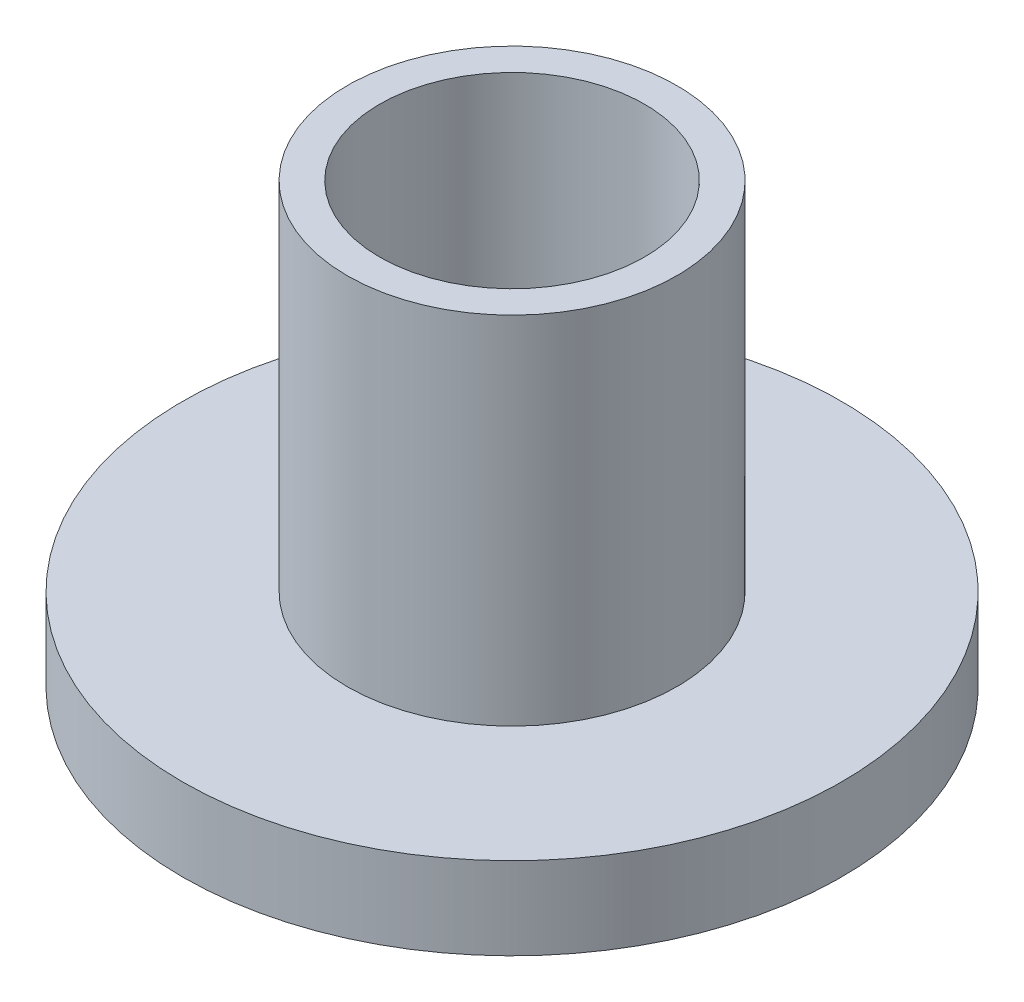
ISO-10303-21;
HEADER;
FILE_DESCRIPTION(('STEP AP214'),'2;1');
FILE_NAME('part.step','',(''),(''),'','','');
FILE_SCHEMA(('AUTOMOTIVE_DESIGN { 1 0 10303 214 1 1 1 1 }'));
ENDSEC;
DATA;
#1=APPLICATION_CONTEXT('core data for automotive mechanical design processes');
#2=APPLICATION_PROTOCOL_DEFINITION('international standard','automotive_design',2000,#1);
#3=PRODUCT_CONTEXT('',#1,'mechanical');
#4=PRODUCT('Part','Part','',(#3));
#5=PRODUCT_RELATED_PRODUCT_CATEGORY('part','',(#4));
#6=PRODUCT_DEFINITION_FORMATION('','',#4);
#7=PRODUCT_DEFINITION_CONTEXT('part definition',#1,'design');
#8=PRODUCT_DEFINITION('design','',#6,#7);
#9=PRODUCT_DEFINITION_SHAPE('','',#8);
#10=(LENGTH_UNIT() NAMED_UNIT(*) SI_UNIT(.MILLI.,.METRE.));
#11=(NAMED_UNIT(*) PLANE_ANGLE_UNIT() SI_UNIT($,.RADIAN.));
#12=(NAMED_UNIT(*) SI_UNIT($,.STERADIAN.) SOLID_ANGLE_UNIT());
#13=UNCERTAINTY_MEASURE_WITH_UNIT(LENGTH_MEASURE(1.E-05),#10,'distance_accuracy_value','');
#14=(GEOMETRIC_REPRESENTATION_CONTEXT(3) GLOBAL_UNCERTAINTY_ASSIGNED_CONTEXT((#13)) GLOBAL_UNIT_ASSIGNED_CONTEXT((#10,
#11,#12)) REPRESENTATION_CONTEXT('',''));
#15=CARTESIAN_POINT('',(0.,0.,0.));
#16=DIRECTION('',(0.,0.,1.));
#17=DIRECTION('',(1.,0.,0.));
#18=AXIS2_PLACEMENT_3D('',#15,#16,#17);
#19=CARTESIAN_POINT('',(0.,1.5875,0.));
#20=DIRECTION('',(0.,-1.,0.));
#21=DIRECTION('',(0.,0.,-1.));
#22=AXIS2_PLACEMENT_3D('',#19,#20,#21);
#23=CYLINDRICAL_SURFACE('',#22,6.35);
#24=CARTESIAN_POINT('',(0.,1.5875,0.));
#25=DIRECTION('',(0.,1.,0.));
#26=DIRECTION('',(0.,0.,1.));
#27=AXIS2_PLACEMENT_3D('',#24,#25,#26);
#28=CIRCLE('',#27,6.35);
#29=CARTESIAN_POINT('',(0.,1.5875,6.35));
#30=VERTEX_POINT('',#29);
#31=EDGE_CURVE('E46',#30,#30,#28,.T.);
#32=ORIENTED_EDGE('',*,*,#31,.F.);
#33=EDGE_LOOP('',(#32));
#34=FACE_BOUND('',#33,.T.);
#35=CARTESIAN_POINT('',(0.,0.,0.));
#36=DIRECTION('',(0.,1.,0.));
#37=DIRECTION('',(0.,0.,1.));
#38=AXIS2_PLACEMENT_3D('',#35,#36,#37);
#39=CIRCLE('',#38,6.35);
#40=CARTESIAN_POINT('',(0.,0.,6.35));
#41=VERTEX_POINT('',#40);
#42=EDGE_CURVE('E42',#41,#41,#39,.T.);
#43=ORIENTED_EDGE('',*,*,#42,.T.);
#44=EDGE_LOOP('',(#43));
#45=FACE_BOUND('',#44,.T.);
#46=ADVANCED_FACE('F39',(#34,#45),#23,.T.);
#47=CARTESIAN_POINT('',(0.,1.5875,0.));
#48=DIRECTION('',(0.,1.,0.));
#49=DIRECTION('',(0.,0.,1.));
#50=AXIS2_PLACEMENT_3D('',#47,#48,#49);
#51=PLANE('',#50);
#52=CARTESIAN_POINT('',(0.,1.5875,0.));
#53=DIRECTION('',(0.,1.,0.));
#54=DIRECTION('',(0.,0.,1.));
#55=AXIS2_PLACEMENT_3D('',#52,#53,#54);
#56=CIRCLE('',#55,3.175);
#57=CARTESIAN_POINT('',(0.,1.5875,3.175));
#58=VERTEX_POINT('',#57);
#59=EDGE_CURVE('E10',#58,#58,#56,.T.);
#60=ORIENTED_EDGE('',*,*,#59,.F.);
#61=EDGE_LOOP('',(#60));
#62=FACE_BOUND('',#61,.T.);
#63=ORIENTED_EDGE('',*,*,#31,.T.);
#64=EDGE_LOOP('',(#63));
#65=FACE_BOUND('',#64,.T.);
#66=ADVANCED_FACE('F83',(#62,#65),#51,.T.);
#67=CARTESIAN_POINT('',(0.,0.,0.));
#68=DIRECTION('',(0.,1.,0.));
#69=DIRECTION('',(0.,0.,1.));
#70=AXIS2_PLACEMENT_3D('',#67,#68,#69);
#71=PLANE('',#70);
#72=CARTESIAN_POINT('',(0.,0.,0.));
#73=DIRECTION('',(0.,1.,0.));
#74=DIRECTION('',(0.,0.,1.));
#75=AXIS2_PLACEMENT_3D('',#72,#73,#74);
#76=CIRCLE('',#75,2.5527);
#77=CARTESIAN_POINT('',(0.,0.,2.5527));
#78=VERTEX_POINT('',#77);
#79=EDGE_CURVE('E55',#78,#78,#76,.T.);
#80=ORIENTED_EDGE('',*,*,#79,.T.);
#81=EDGE_LOOP('',(#80));
#82=FACE_BOUND('',#81,.T.);
#83=ORIENTED_EDGE('',*,*,#42,.F.);
#84=EDGE_LOOP('',(#83));
#85=FACE_BOUND('',#84,.T.);
#86=ADVANCED_FACE('F62',(#82,#85),#71,.F.);
#87=CARTESIAN_POINT('',(0.,8.4455,0.));
#88=DIRECTION('',(0.,-1.,0.));
#89=DIRECTION('',(0.,0.,-1.));
#90=AXIS2_PLACEMENT_3D('',#87,#88,#89);
#91=CYLINDRICAL_SURFACE('',#90,3.175);
#92=CARTESIAN_POINT('',(0.,8.4455,0.));
#93=DIRECTION('',(0.,1.,0.));
#94=DIRECTION('',(0.,0.,1.));
#95=AXIS2_PLACEMENT_3D('',#92,#93,#94);
#96=CIRCLE('',#95,3.175);
#97=CARTESIAN_POINT('',(0.,8.4455,3.175));
#98=VERTEX_POINT('',#97);
#99=EDGE_CURVE('E52',#98,#98,#96,.T.);
#100=ORIENTED_EDGE('',*,*,#99,.F.);
#101=EDGE_LOOP('',(#100));
#102=FACE_BOUND('',#101,.T.);
#103=ORIENTED_EDGE('',*,*,#59,.T.);
#104=EDGE_LOOP('',(#103));
#105=FACE_BOUND('',#104,.T.);
#106=ADVANCED_FACE('F74',(#102,#105),#91,.T.);
#107=CARTESIAN_POINT('',(0.,8.4455,0.));
#108=DIRECTION('',(0.,1.,0.));
#109=DIRECTION('',(0.,0.,1.));
#110=AXIS2_PLACEMENT_3D('',#107,#108,#109);
#111=PLANE('',#110);
#112=CARTESIAN_POINT('',(0.,8.4455,0.));
#113=DIRECTION('',(0.,1.,0.));
#114=DIRECTION('',(0.,0.,1.));
#115=AXIS2_PLACEMENT_3D('',#112,#113,#114);
#116=CIRCLE('',#115,2.5527);
#117=CARTESIAN_POINT('',(0.,8.4455,2.5527));
#118=VERTEX_POINT('',#117);
#119=EDGE_CURVE('E56',#118,#118,#116,.T.);
#120=ORIENTED_EDGE('',*,*,#119,.F.);
#121=EDGE_LOOP('',(#120));
#122=FACE_BOUND('',#121,.T.);
#123=ORIENTED_EDGE('',*,*,#99,.T.);
#124=EDGE_LOOP('',(#123));
#125=FACE_BOUND('',#124,.T.);
#126=ADVANCED_FACE('F68',(#122,#125),#111,.T.);
#127=CARTESIAN_POINT('',(0.,0.,0.));
#128=DIRECTION('',(0.,1.,0.));
#129=DIRECTION('',(0.,0.,1.));
#130=AXIS2_PLACEMENT_3D('',#127,#128,#129);
#131=CYLINDRICAL_SURFACE('',#130,2.5527);
#132=ORIENTED_EDGE('',*,*,#79,.F.);
#133=EDGE_LOOP('',(#132));
#134=FACE_BOUND('',#133,.T.);
#135=ORIENTED_EDGE('',*,*,#119,.T.);
#136=EDGE_LOOP('',(#135));
#137=FACE_BOUND('',#136,.T.);
#138=ADVANCED_FACE('F65',(#134,#137),#131,.F.);
#139=CLOSED_SHELL('',(#46,#66,#86,#106,#126,#138));
#140=MANIFOLD_SOLID_BREP('B2',#139);
#141=ADVANCED_BREP_SHAPE_REPRESENTATION('',(#18,#140),#14);
#142=SHAPE_DEFINITION_REPRESENTATION(#9,#141);
ENDSEC;
END-ISO-10303-21;
